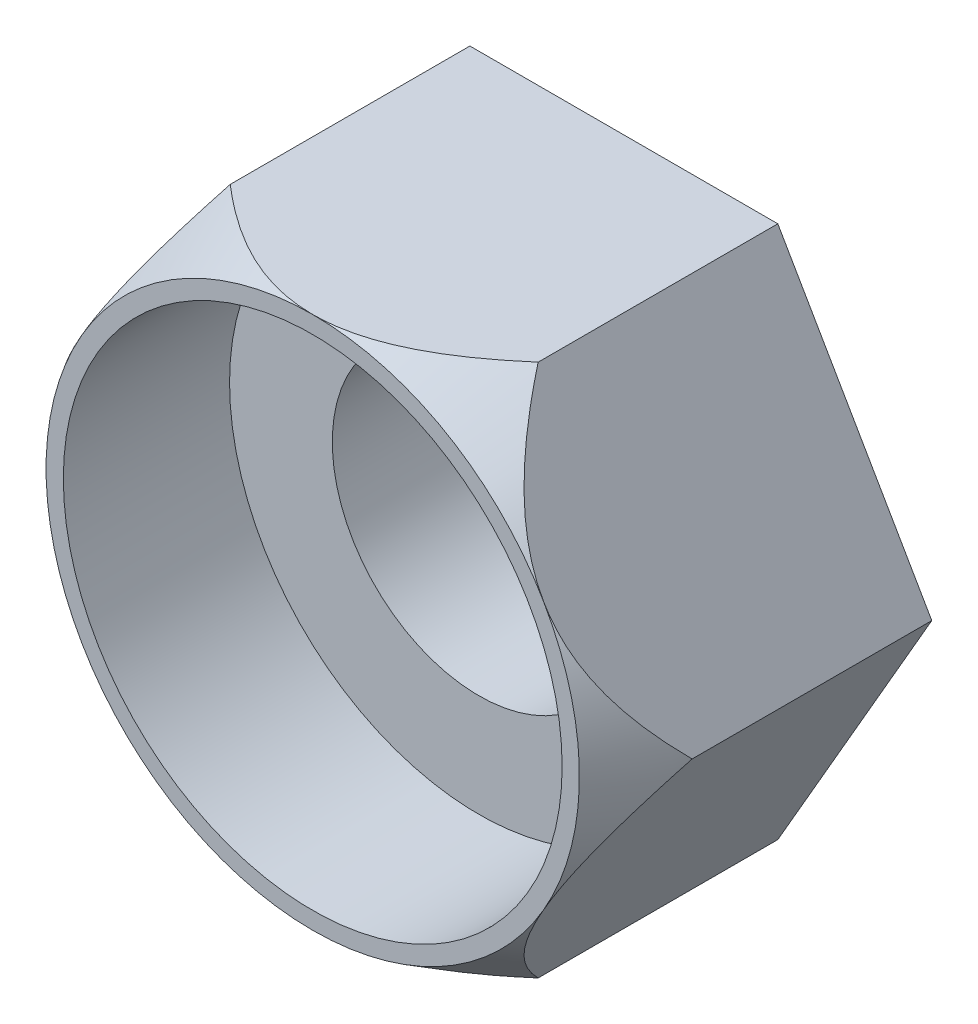
ISO-10303-21;
HEADER;
FILE_DESCRIPTION(('STEP AP214'),'2;1');
FILE_NAME('part.step','',(''),(''),'','','');
FILE_SCHEMA(('AUTOMOTIVE_DESIGN { 1 0 10303 214 1 1 1 1 }'));
ENDSEC;
DATA;
#1=APPLICATION_CONTEXT('core data for automotive mechanical design processes');
#2=APPLICATION_PROTOCOL_DEFINITION('international standard','automotive_design',2000,#1);
#3=PRODUCT_CONTEXT('',#1,'mechanical');
#4=PRODUCT('Part','Part','',(#3));
#5=PRODUCT_RELATED_PRODUCT_CATEGORY('part','',(#4));
#6=PRODUCT_DEFINITION_FORMATION('','',#4);
#7=PRODUCT_DEFINITION_CONTEXT('part definition',#1,'design');
#8=PRODUCT_DEFINITION('design','',#6,#7);
#9=PRODUCT_DEFINITION_SHAPE('','',#8);
#10=(LENGTH_UNIT() NAMED_UNIT(*) SI_UNIT(.MILLI.,.METRE.));
#11=(NAMED_UNIT(*) PLANE_ANGLE_UNIT() SI_UNIT($,.RADIAN.));
#12=(NAMED_UNIT(*) SI_UNIT($,.STERADIAN.) SOLID_ANGLE_UNIT());
#13=UNCERTAINTY_MEASURE_WITH_UNIT(LENGTH_MEASURE(1.E-05),#10,'distance_accuracy_value','');
#14=(GEOMETRIC_REPRESENTATION_CONTEXT(3) GLOBAL_UNCERTAINTY_ASSIGNED_CONTEXT((#13)) GLOBAL_UNIT_ASSIGNED_CONTEXT((#10,
#11,#12)) REPRESENTATION_CONTEXT('',''));
#15=CARTESIAN_POINT('',(0.,0.,0.));
#16=DIRECTION('',(0.,0.,1.));
#17=DIRECTION('',(1.,0.,0.));
#18=AXIS2_PLACEMENT_3D('',#15,#16,#17);
#19=CARTESIAN_POINT('',(17.3205080756888,-30.,17.5));
#20=DIRECTION('',(-0.866025403784439,0.5,0.));
#21=DIRECTION('',(-0.5,-0.866025403784439,0.));
#22=AXIS2_PLACEMENT_3D('',#19,#20,#21);
#23=PLANE('',#22);
#24=CARTESIAN_POINT('',(17.3203926056349,-30.0002,9.46132422606635));
#25=CARTESIAN_POINT('',(17.5015433719719,-29.6864376688743,9.77504736351007));
#26=CARTESIAN_POINT('',(17.6845150908956,-29.3695213553503,10.0846236065358));
#27=CARTESIAN_POINT('',(18.0544721795627,-28.7287368811586,10.6942397910882));
#28=CARTESIAN_POINT('',(18.2414586870006,-28.4048667499463,10.9942769680895));
#29=CARTESIAN_POINT('',(18.620709415875,-27.7479852187283,11.5849420042548));
#30=CARTESIAN_POINT('',(18.8129962456226,-27.4149346599792,11.875511989338));
#31=CARTESIAN_POINT('',(19.2022135833052,-26.7407904559261,12.4438880783537));
#32=CARTESIAN_POINT('',(19.3991437340239,-26.3996974293392,12.7216951593354));
#33=CARTESIAN_POINT('',(19.803174892366,-25.6998949352497,13.2696586125899));
#34=CARTESIAN_POINT('',(20.0104072221741,-25.3409580110513,13.5394302722734));
#35=CARTESIAN_POINT('',(20.4304321667509,-24.6134534665979,14.0610501660691));
#36=CARTESIAN_POINT('',(20.6432254446102,-24.2448846978365,14.3128962492704));
#37=CARTESIAN_POINT('',(21.2895218045095,-23.125466565744,15.0363374820305));
#38=CARTESIAN_POINT('',(21.731973002854,-22.3591186103416,15.4772664210009));
#39=CARTESIAN_POINT('',(22.4331426866156,-21.1446570933396,16.0729561806084));
#40=CARTESIAN_POINT('',(22.683690349479,-20.7106958115425,16.266550291096));
#41=CARTESIAN_POINT('',(23.1913554054523,-19.8313941413695,16.6162103369082));
#42=CARTESIAN_POINT('',(23.4484732889673,-19.386052903587,16.772273461793));
#43=CARTESIAN_POINT('',(23.9661843264303,-18.4893510830619,17.0408901305234));
#44=CARTESIAN_POINT('',(24.2267334071771,-18.0380668373429,17.1537807649683));
#45=CARTESIAN_POINT('',(24.7517830807522,-17.1286541262135,17.3337372313796));
#46=CARTESIAN_POINT('',(25.0162834008726,-16.6705261331467,17.400806211082));
#47=CARTESIAN_POINT('',(25.5496947767419,-15.7466305288059,17.4868130868717));
#48=CARTESIAN_POINT('',(25.8186240451463,-15.2808313722871,17.5053048596655));
#49=CARTESIAN_POINT('',(26.3561672938058,-14.3497791543433,17.4920692193041));
#50=CARTESIAN_POINT('',(26.6247812751322,-13.8845260910625,17.4603419772978));
#51=CARTESIAN_POINT('',(27.1600630395246,-12.9573908787697,17.3478951009107));
#52=CARTESIAN_POINT('',(27.4267245658246,-12.4955195667943,17.2670574843469));
#53=CARTESIAN_POINT('',(27.9555265444054,-11.5796076727494,17.059545195104));
#54=CARTESIAN_POINT('',(28.217666372929,-11.1255681710592,16.9328642505965));
#55=CARTESIAN_POINT('',(28.8109712000303,-10.0979340661439,16.5954865288861));
#56=CARTESIAN_POINT('',(29.1401874153144,-9.52771485459625,16.3710893189568));
#57=CARTESIAN_POINT('',(29.7872125592073,-8.40703443159918,15.8641852466915));
#58=CARTESIAN_POINT('',(30.1050163799999,-7.85658206714694,15.5816527364092));
#59=CARTESIAN_POINT('',(30.7300705233182,-6.7739565334381,14.9675918973374));
#60=CARTESIAN_POINT('',(31.0372719402252,-6.24186807119799,14.6358663929186));
#61=CARTESIAN_POINT('',(31.6401427089066,-5.1976652694438,13.9333706617039));
#62=CARTESIAN_POINT('',(31.9358139486631,-4.68554765984869,13.5626068642423));
#63=CARTESIAN_POINT('',(32.4388584329592,-3.81424905458047,12.892788530556));
#64=CARTESIAN_POINT('',(32.6486994722424,-3.45079371302899,12.6010727982593));
#65=CARTESIAN_POINT('',(33.0630719810684,-2.73307947448248,12.0029851715184));
#66=CARTESIAN_POINT('',(33.267603717481,-2.37882011525572,11.6966140159312));
#67=CARTESIAN_POINT('',(33.6694894287724,-1.68273364446302,11.0747580298597));
#68=CARTESIAN_POINT('',(33.8668982564758,-1.34081152501801,10.7594144353305));
#69=CARTESIAN_POINT('',(34.2572552840001,-0.664693320254428,10.1180198060045));
#70=CARTESIAN_POINT('',(34.4502043938489,-0.330495658721023,9.7919709891245));
#71=CARTESIAN_POINT('',(34.6411316214314,0.00020000000001035,9.46132422606637));
#72=B_SPLINE_CURVE_WITH_KNOTS('',3,(#24,#25,#26,#27,#28,#29,#30,#31,#32,#33,#34,#35,#36,#37,#38,
#39,#40,#41,#42,#43,#44,#45,#46,#47,#48,#49,#50,#51,#52,#53,#54,#55,#56,#57,#58,#59,#60,#61,#62,
#63,#64,#65,#66,#67,#68,#69,#70,#71),.UNSPECIFIED.,.F.,.F.,(4,2,2,2,2,2,2,2,2,2,2,2,2,2,2,2,2,2,
2,2,2,2,2,4),(0.,1.43778765195007,2.87598826086788,4.32176293252995,5.76742673954517,
7.25054658281495,8.73384408840334,11.692930966267,13.3033287566646,14.9138471012569,
16.5115204861772,18.1090841072783,19.7212689536101,21.3334483055512,22.9495161388129,
24.5658051500477,26.6492580458904,28.7336320912353,30.8265986116724,32.919220972703,
34.4522227914168,35.9851474047176,37.5008331274598,39.0162067864697),.UNSPECIFIED.);
#73=CARTESIAN_POINT('',(17.3205080756888,-30.,9.46152422706635));
#74=VERTEX_POINT('',#73);
#75=CARTESIAN_POINT('',(25.9807621135332,-15.,17.5));
#76=VERTEX_POINT('',#75);
#77=EDGE_CURVE('E208',#74,#76,#72,.T.);
#78=ORIENTED_EDGE('',*,*,#77,.F.);
#79=DIRECTION('',(0.,0.,-1.));
#80=VECTOR('',#79,1.);
#81=CARTESIAN_POINT('',(17.3205080756888,-30.,17.5));
#82=LINE('',#81,#80);
#83=CARTESIAN_POINT('',(17.3205080756888,-30.,-17.5));
#84=VERTEX_POINT('',#83);
#85=EDGE_CURVE('E211',#74,#84,#82,.T.);
#86=ORIENTED_EDGE('',*,*,#85,.T.);
#87=DIRECTION('',(0.5,0.866025403784439,0.));
#88=VECTOR('',#87,1.);
#89=CARTESIAN_POINT('',(17.3205080756888,-30.,-17.5));
#90=LINE('',#89,#88);
#91=CARTESIAN_POINT('',(34.6410161513775,0.,-17.5));
#92=VERTEX_POINT('',#91);
#93=EDGE_CURVE('E215',#84,#92,#90,.T.);
#94=ORIENTED_EDGE('',*,*,#93,.T.);
#95=DIRECTION('',(0.,0.,-1.));
#96=VECTOR('',#95,1.);
#97=CARTESIAN_POINT('',(34.6410161513775,0.,17.5));
#98=LINE('',#97,#96);
#99=CARTESIAN_POINT('',(34.6410161513775,0.,9.46152422706636));
#100=VERTEX_POINT('',#99);
#101=EDGE_CURVE('E233',#100,#92,#98,.T.);
#102=ORIENTED_EDGE('',*,*,#101,.F.);
#103=EDGE_CURVE('E214',#76,#100,#72,.T.);
#104=ORIENTED_EDGE('',*,*,#103,.F.);
#105=EDGE_LOOP('',(#78,#86,#94,#102,#104));
#106=FACE_BOUND('',#105,.T.);
#107=ADVANCED_FACE('F37',(#106),#23,.F.);
#108=CARTESIAN_POINT('',(34.6410161513775,0.,17.5));
#109=DIRECTION('',(-0.866025403784439,-0.5,0.));
#110=DIRECTION('',(0.5,-0.866025403784439,0.));
#111=AXIS2_PLACEMENT_3D('',#108,#109,#110);
#112=PLANE('',#111);
#113=CARTESIAN_POINT('',(34.6411316214314,-0.000199999999989065,9.46132422606637));
#114=CARTESIAN_POINT('',(34.4599808550944,0.313562331125672,9.77504736351009));
#115=CARTESIAN_POINT('',(34.2770091361707,0.630478644649733,10.0846236065358));
#116=CARTESIAN_POINT('',(33.9070520475036,1.27126311884139,10.6942397910882));
#117=CARTESIAN_POINT('',(33.7200655400657,1.59513325005368,10.9942769680895));
#118=CARTESIAN_POINT('',(33.3408148111913,2.25201478127171,11.5849420042549));
#119=CARTESIAN_POINT('',(33.1485279814437,2.58506534002085,11.8755119893381));
#120=CARTESIAN_POINT('',(32.7593106437611,3.25920954407389,12.4438880783537));
#121=CARTESIAN_POINT('',(32.5623804930424,3.60030257066084,12.7216951593354));
#122=CARTESIAN_POINT('',(32.1583493347003,4.30010506475032,13.26965861259));
#123=CARTESIAN_POINT('',(31.9511170048922,4.65904198894874,13.5394302722734));
#124=CARTESIAN_POINT('',(31.5310920603154,5.38654653340208,14.0610501660691));
#125=CARTESIAN_POINT('',(31.3182987824561,5.75511530216355,14.3128962492704));
#126=CARTESIAN_POINT('',(30.6720024225568,6.87453343425598,15.0363374820305));
#127=CARTESIAN_POINT('',(30.2295512242123,7.64088138965841,15.4772664210009));
#128=CARTESIAN_POINT('',(29.5283815404507,8.85534290666036,16.0729561806084));
#129=CARTESIAN_POINT('',(29.2778338775873,9.28930418845755,16.266550291096));
#130=CARTESIAN_POINT('',(28.770168821614,10.1686058586305,16.6162103369082));
#131=CARTESIAN_POINT('',(28.513050938099,10.6139470964131,16.772273461793));
#132=CARTESIAN_POINT('',(27.995339900636,11.5106489169381,17.0408901305234));
#133=CARTESIAN_POINT('',(27.7347908198892,11.9619331626571,17.1537807649683));
#134=CARTESIAN_POINT('',(27.2097411463141,12.8713458737865,17.3337372313796));
#135=CARTESIAN_POINT('',(26.9452408261937,13.3294738668534,17.400806211082));
#136=CARTESIAN_POINT('',(26.4118294503244,14.2533694711942,17.4868130868717));
#137=CARTESIAN_POINT('',(26.14290018192,14.7191686277129,17.5053048596655));
#138=CARTESIAN_POINT('',(25.6053569332605,15.6502208456567,17.4920692193041));
#139=CARTESIAN_POINT('',(25.3367429519341,16.1154739089375,17.4603419772977));
#140=CARTESIAN_POINT('',(24.8014611875417,17.0426091212303,17.3478951009107));
#141=CARTESIAN_POINT('',(24.5347996612417,17.5044804332057,17.2670574843469));
#142=CARTESIAN_POINT('',(24.0059976826609,18.4203923272506,17.059545195104));
#143=CARTESIAN_POINT('',(23.7438578541373,18.8744318289408,16.9328642505965));
#144=CARTESIAN_POINT('',(23.150553027036,19.9020659338561,16.5954865288861));
#145=CARTESIAN_POINT('',(22.8213368117519,20.4722851454038,16.3710893189568));
#146=CARTESIAN_POINT('',(22.174311667859,21.5929655684008,15.8641852466915));
#147=CARTESIAN_POINT('',(21.8565078470664,22.1434179328531,15.5816527364092));
#148=CARTESIAN_POINT('',(21.2314537037481,23.2260434665619,14.9675918973374));
#149=CARTESIAN_POINT('',(20.924252286841,23.758131928802,14.6358663929186));
#150=CARTESIAN_POINT('',(20.3213815181597,24.8023347305562,13.9333706617039));
#151=CARTESIAN_POINT('',(20.0257102784032,25.3144523401513,13.5626068642423));
#152=CARTESIAN_POINT('',(19.5226657941071,26.1857509454195,12.8927885305559));
#153=CARTESIAN_POINT('',(19.3128247548239,26.549206286971,12.6010727982593));
#154=CARTESIAN_POINT('',(18.8984522459979,27.2669205255175,12.0029851715184));
#155=CARTESIAN_POINT('',(18.6939205095854,27.6211798847443,11.6966140159312));
#156=CARTESIAN_POINT('',(18.2920347982939,28.317266355537,11.0747580298597));
#157=CARTESIAN_POINT('',(18.0946259705905,28.659188474982,10.7594144353305));
#158=CARTESIAN_POINT('',(17.7042689430662,29.3353066797456,10.1180198060045));
#159=CARTESIAN_POINT('',(17.5113198332173,29.669504341279,9.79197098912449));
#160=CARTESIAN_POINT('',(17.3203926056349,30.0002,9.46132422606636));
#161=B_SPLINE_CURVE_WITH_KNOTS('',3,(#113,#114,#115,#116,#117,#118,#119,#120,#121,#122,#123,
#124,#125,#126,#127,#128,#129,#130,#131,#132,#133,#134,#135,#136,#137,#138,#139,#140,#141,#142,
#143,#144,#145,#146,#147,#148,#149,#150,#151,#152,#153,#154,#155,#156,#157,#158,#159,#160),
.UNSPECIFIED.,.F.,.F.,(4,2,2,2,2,2,2,2,2,2,2,2,2,2,2,2,2,2,2,2,2,2,2,4),(0.,1.43778765195006,
2.87598826086787,4.32176293252995,5.76742673954518,7.25054658281495,8.73384408840334,
11.692930966267,13.3033287566645,14.9138471012568,16.5115204861772,18.1090841072782,
19.7212689536101,21.3334483055512,22.9495161388129,24.5658051500476,26.6492580458904,
28.7336320912353,30.8265986116724,32.919220972703,34.4522227914168,35.9851474047176,
37.5008331274598,39.0162067864697),.UNSPECIFIED.);
#162=CARTESIAN_POINT('',(25.9807621135332,15.,17.5));
#163=VERTEX_POINT('',#162);
#164=EDGE_CURVE('E263',#100,#163,#161,.T.);
#165=ORIENTED_EDGE('',*,*,#164,.F.);
#166=ORIENTED_EDGE('',*,*,#101,.T.);
#167=DIRECTION('',(-0.5,0.866025403784438,0.));
#168=VECTOR('',#167,1.);
#169=CARTESIAN_POINT('',(34.6410161513775,0.,-17.5));
#170=LINE('',#169,#168);
#171=CARTESIAN_POINT('',(17.3205080756888,30.,-17.5));
#172=VERTEX_POINT('',#171);
#173=EDGE_CURVE('E253',#92,#172,#170,.T.);
#174=ORIENTED_EDGE('',*,*,#173,.T.);
#175=DIRECTION('',(0.,0.,-1.));
#176=VECTOR('',#175,1.);
#177=CARTESIAN_POINT('',(17.3205080756888,30.,17.5));
#178=LINE('',#177,#176);
#179=CARTESIAN_POINT('',(17.3205080756889,30.,9.46152422706628));
#180=VERTEX_POINT('',#179);
#181=EDGE_CURVE('E232',#180,#172,#178,.T.);
#182=ORIENTED_EDGE('',*,*,#181,.F.);
#183=EDGE_CURVE('E113',#163,#180,#161,.T.);
#184=ORIENTED_EDGE('',*,*,#183,.F.);
#185=EDGE_LOOP('',(#165,#166,#174,#182,#184));
#186=FACE_BOUND('',#185,.T.);
#187=ADVANCED_FACE('F199',(#186),#112,.F.);
#188=CARTESIAN_POINT('',(17.3205080756888,30.,17.5));
#189=DIRECTION('',(0.,-1.,0.));
#190=DIRECTION('',(0.,0.,-1.));
#191=AXIS2_PLACEMENT_3D('',#188,#189,#190);
#192=PLANE('',#191);
#193=CARTESIAN_POINT('',(54.8417749549226,30.,-38.81063674065));
#194=CARTESIAN_POINT('',(54.3698066975204,30.,-38.0934598874419));
#195=CARTESIAN_POINT('',(53.8968634479029,30.,-37.3769249196472));
#196=CARTESIAN_POINT('',(52.9488718780864,30.,-35.9452467656896));
#197=CARTESIAN_POINT('',(52.4738235533704,30.,-35.2301035825177));
#198=CARTESIAN_POINT('',(51.0452634009373,30.,-33.0868863632887));
#199=CARTESIAN_POINT('',(50.0883641103612,30.,-31.6610668127441));
#200=CARTESIAN_POINT('',(48.1630483284752,30.,-28.8150325186434));
#201=CARTESIAN_POINT('',(47.1946207756503,30.,-27.3948252533106));
#202=CARTESIAN_POINT('',(45.2454130199202,30.,-24.562925599961));
#203=CARTESIAN_POINT('',(44.2646329508382,30.,-23.1512331199424));
#204=CARTESIAN_POINT('',(42.2654967927086,30.,-20.3055131736067));
#205=CARTESIAN_POINT('',(41.2467967780936,30.,-18.8717270547378));
#206=CARTESIAN_POINT('',(39.1908994622977,30.,-16.0173901450402));
#207=CARTESIAN_POINT('',(38.1537017399908,30.,-14.5968396566628));
#208=CARTESIAN_POINT('',(36.5812291042553,30.,-12.4789094563309));
#209=CARTESIAN_POINT('',(36.0544156444764,30.,-11.7752427887318));
#210=CARTESIAN_POINT('',(34.9945112368173,30.,-10.3726559603895));
#211=CARTESIAN_POINT('',(34.4614203326411,30.,-9.67373576665442));
#212=CARTESIAN_POINT('',(33.3882612389497,30.,-8.28131452805852));
#213=CARTESIAN_POINT('',(32.8481933372735,30.,-7.58781326151991));
#214=CARTESIAN_POINT('',(31.7602230811637,30.,-6.20699060126229));
#215=CARTESIAN_POINT('',(31.2123208187983,30.,-5.51966913507362));
#216=CARTESIAN_POINT('',(30.110441563519,30.,-4.15554467570753));
#217=CARTESIAN_POINT('',(29.5565083358308,30.,-3.4787063703457));
#218=CARTESIAN_POINT('',(28.4387720432569,30.,-2.13321547247852));
#219=CARTESIAN_POINT('',(27.8749689586498,30.,-1.46456289633407));
#220=CARTESIAN_POINT('',(26.7359108275702,30.,-0.136566543850093));
#221=CARTESIAN_POINT('',(26.16065093462,30.,0.522773082289273));
#222=CARTESIAN_POINT('',(24.9973372611181,30.,1.83007632139165));
#223=CARTESIAN_POINT('',(24.4092836366771,30.,2.47804007299038));
#224=CARTESIAN_POINT('',(23.2217882522528,30.,3.75681369257884));
#225=CARTESIAN_POINT('',(22.6224275651677,30.,4.38769866943553));
#226=CARTESIAN_POINT('',(21.4069383846953,30.,5.63323499296381));
#227=CARTESIAN_POINT('',(20.7908088173537,30.,6.24788529490313));
#228=CARTESIAN_POINT('',(19.539651514219,30.,7.45680152024008));
#229=CARTESIAN_POINT('',(18.9046375705136,30.,8.05108166964219));
#230=CARTESIAN_POINT('',(17.6123285190527,30.,9.2147991490815));
#231=CARTESIAN_POINT('',(16.9550377765249,30.,9.78424129677916));
#232=CARTESIAN_POINT('',(15.7542362385713,30.,10.7764641279948));
#233=CARTESIAN_POINT('',(15.2155574177048,30.,11.2050794484426));
#234=CARTESIAN_POINT('',(14.1200222863239,30.,12.03854685363));
#235=CARTESIAN_POINT('',(13.5631659401957,30.,12.4433988918077));
#236=CARTESIAN_POINT('',(12.428232906915,30.,13.224811084617));
#237=CARTESIAN_POINT('',(11.8501171544807,30.,13.601314839313));
#238=CARTESIAN_POINT('',(10.6718595544517,30.,14.3184980562226));
#239=CARTESIAN_POINT('',(10.0717165600717,30.,14.6591756496704));
#240=CARTESIAN_POINT('',(8.83721186823437,30.,15.3022172245935));
#241=CARTESIAN_POINT('',(8.20242758286657,30.,15.6037767594259));
#242=CARTESIAN_POINT('',(6.90875843241133,30.,16.1509749452444));
#243=CARTESIAN_POINT('',(6.24987424295473,30.,16.396615162513));
#244=CARTESIAN_POINT('',(5.24710417264603,30.,16.7142636714117));
#245=CARTESIAN_POINT('',(4.91111259043356,30.,16.8115366639721));
#246=CARTESIAN_POINT('',(4.23446498466812,30.,16.9881330038484));
#247=CARTESIAN_POINT('',(3.89380979599959,30.,17.0674595205299));
#248=CARTESIAN_POINT('',(3.20866713569363,30.,17.2069600108132));
#249=CARTESIAN_POINT('',(2.8641805015,30.,17.2671380877624));
#250=CARTESIAN_POINT('',(2.17229107037283,30.,17.3673772590857));
#251=CARTESIAN_POINT('',(1.82488844048348,30.,17.4074394979159));
#252=CARTESIAN_POINT('',(1.17532464512365,30.,17.4627509801405));
#253=CARTESIAN_POINT('',(0.873384408333856,30.,17.4806190110972));
#254=CARTESIAN_POINT('',(0.268947334594082,30.,17.5005477714375));
#255=CARTESIAN_POINT('',(-0.0335495556338399,30.,17.5026068995891));
#256=CARTESIAN_POINT('',(-0.638177225595532,30.,17.4908805501877));
#257=CARTESIAN_POINT('',(-0.940308068673057,30.,17.4770983867141));
#258=CARTESIAN_POINT('',(-1.54346304106426,30.,17.4338961665565));
#259=CARTESIAN_POINT('',(-1.84448700632353,30.,17.404473878967));
#260=CARTESIAN_POINT('',(-2.74550914367045,30.,17.2931635718795));
#261=CARTESIAN_POINT('',(-3.3428024844659,30.,17.1882460028853));
#262=CARTESIAN_POINT('',(-4.52454040322292,30.,16.9221827369976));
#263=CARTESIAN_POINT('',(-5.10898229378963,30.,16.7610253963356));
#264=CARTESIAN_POINT('',(-6.38489609850357,30.,16.3495285934435));
#265=CARTESIAN_POINT('',(-7.07258461940976,30.,16.0874955021665));
#266=CARTESIAN_POINT('',(-8.42172926812182,30.,15.5032591775682));
#267=CARTESIAN_POINT('',(-9.08317618178923,30.,15.1810350323155));
#268=CARTESIAN_POINT('',(-10.3817994160758,30.,14.4870098129129));
#269=CARTESIAN_POINT('',(-11.018899462744,30.,14.1150671216405));
#270=CARTESIAN_POINT('',(-11.9558500877234,30.,13.5278745145276));
#271=CARTESIAN_POINT('',(-12.2650379053911,30.,13.3272728447648));
#272=CARTESIAN_POINT('',(-12.8775360019254,30.,12.917263602686));
#273=CARTESIAN_POINT('',(-13.1808461844221,30.,12.707855886164));
#274=CARTESIAN_POINT('',(-13.9294139733907,30.,12.1764091267126));
#275=CARTESIAN_POINT('',(-14.3712498693582,30.,11.8495496835743));
#276=CARTESIAN_POINT('',(-15.2434983626696,30.,11.1808763196849));
#277=CARTESIAN_POINT('',(-15.6739094750306,30.,10.8390604700583));
#278=CARTESIAN_POINT('',(-16.5244529608709,30.,10.1424616645935));
#279=CARTESIAN_POINT('',(-16.944579941808,30.,9.78767213919694));
#280=CARTESIAN_POINT('',(-17.7752301870979,30.,9.06708055725937));
#281=CARTESIAN_POINT('',(-18.1857538170416,30.,8.70127892115586));
#282=CARTESIAN_POINT('',(-18.9989407597312,30.,7.95932832370775));
#283=CARTESIAN_POINT('',(-19.4015853428894,30.,7.58315886831804));
#284=CARTESIAN_POINT('',(-20.198894457315,30.,6.82244501984019));
#285=CARTESIAN_POINT('',(-20.5935586808821,30.,6.43790030500826));
#286=CARTESIAN_POINT('',(-21.7664415871399,30.,5.27351836008054));
#287=CARTESIAN_POINT('',(-22.5337893336163,30.,4.48271332949142));
#288=CARTESIAN_POINT('',(-24.0511259491533,30.,2.87110265195253));
#289=CARTESIAN_POINT('',(-24.8008926015313,30.,2.05008913436568));
#290=CARTESIAN_POINT('',(-26.279757400597,30.,0.389632814983656));
#291=CARTESIAN_POINT('',(-27.0088546251102,30.,-0.449810806122137));
#292=CARTESIAN_POINT('',(-28.4485887780287,30.,-2.14245469485068));
#293=CARTESIAN_POINT('',(-29.1592485437142,30.,-2.99563559175864));
#294=CARTESIAN_POINT('',(-30.5656826069167,30.,-4.71419836035279));
#295=CARTESIAN_POINT('',(-31.2614564875367,30.,-5.57958057262831));
#296=CARTESIAN_POINT('',(-32.4720660429807,30.,-7.10820720508888));
#297=CARTESIAN_POINT('',(-32.9896484009732,30.,-7.7692814977187));
#298=CARTESIAN_POINT('',(-34.018234822074,30.,-9.09653114579356));
#299=CARTESIAN_POINT('',(-34.5292388446416,30.,-9.7627065326351));
#300=CARTESIAN_POINT('',(-36.0534178371619,30.,-11.7679893416037));
#301=CARTESIAN_POINT('',(-37.0577409971185,30.,-13.1138296468467));
#302=CARTESIAN_POINT('',(-39.0476687517953,30.,-15.8205023769651));
#303=CARTESIAN_POINT('',(-40.0332615172277,30.,-17.1813434711768));
#304=CARTESIAN_POINT('',(-41.9883705902431,30.,-19.9144832009411));
#305=CARTESIAN_POINT('',(-42.9578871250184,30.,-21.2867816741631));
#306=CARTESIAN_POINT('',(-44.8520003896086,30.,-23.9958376963338));
#307=CARTESIAN_POINT('',(-45.7770302526825,30.,-25.3322928379386));
#308=CARTESIAN_POINT('',(-47.6163303112394,30.,-28.0125951720974));
#309=CARTESIAN_POINT('',(-48.5306004287462,30.,-29.3564424181187));
#310=CARTESIAN_POINT('',(-50.3489507636267,30.,-32.0489817257916));
#311=CARTESIAN_POINT('',(-51.2530405511647,30.,-33.3976673307322));
#312=CARTESIAN_POINT('',(-53.0531548256671,30.,-36.1003656375763));
#313=CARTESIAN_POINT('',(-53.9491795043259,30.,-37.4543782117613));
#314=CARTESIAN_POINT('',(-54.8417749549226,30.,-38.81063674065));
#315=B_SPLINE_CURVE_WITH_KNOTS('',3,(#193,#194,#195,#196,#197,#198,#199,#200,#201,#202,#203,
#204,#205,#206,#207,#208,#209,#210,#211,#212,#213,#214,#215,#216,#217,#218,#219,#220,#221,#222,
#223,#224,#225,#226,#227,#228,#229,#230,#231,#232,#233,#234,#235,#236,#237,#238,#239,#240,#241,
#242,#243,#244,#245,#246,#247,#248,#249,#250,#251,#252,#253,#254,#255,#256,#257,#258,#259,#260,
#261,#262,#263,#264,#265,#266,#267,#268,#269,#270,#271,#272,#273,#274,#275,#276,#277,#278,#279,
#280,#281,#282,#283,#284,#285,#286,#287,#288,#289,#290,#291,#292,#293,#294,#295,#296,#297,#298,
#299,#300,#301,#302,#303,#304,#305,#306,#307,#308,#309,#310,#311,#312,#313,#314),.UNSPECIFIED.,
.F.,.F.,(4,2,2,2,2,2,2,2,2,2,2,2,2,2,2,2,2,2,2,2,2,2,2,2,2,2,2,2,2,2,2,2,2,2,2,2,2,2,2,2,2,2,2,
2,2,2,2,2,2,2,2,2,2,2,2,2,2,2,2,2,4),(0.,2.57562850950916,5.15126254827866,10.3026819734722,
15.4595230900626,20.6163083870271,25.8926940341474,31.1691999592875,33.8062367705834,
36.4432552335446,39.0801652504257,41.7170443041883,44.3408088843709,46.964578707843,
49.5894830645975,52.2143554098811,54.824695592763,57.4352033487549,60.0438492223416,
62.6519868436924,64.7166340084099,66.7812852184812,68.8499411591556,70.9187049516782,
73.0248872602211,75.1310105680027,76.1799693987868,77.2287428375298,78.2772913814698,
79.3257802632755,80.232785501438,81.1398826059778,82.0467899756897,82.9538267412942,
84.7698565788008,86.5862626267297,88.7903965046647,90.9952975848896,93.2066184811697,
94.3121868773941,95.4177733852422,97.0661714767035,98.7147827865327,100.364240799425,
102.013635916418,103.666565621858,105.319558938607,108.624572104773,111.959735426287,
115.295047313971,118.626008983534,121.95706381887,124.475790051357,126.994531798722,
132.032106065128,137.072762660946,142.113347960488,146.989365843799,151.86541904207,
156.73642375829,161.607312391307),.UNSPECIFIED.);
#316=CARTESIAN_POINT('',(0.,30.,17.5));
#317=VERTEX_POINT('',#316);
#318=EDGE_CURVE('E109',#180,#317,#315,.T.);
#319=ORIENTED_EDGE('',*,*,#318,.F.);
#320=ORIENTED_EDGE('',*,*,#181,.T.);
#321=DIRECTION('',(-1.,0.,0.));
#322=VECTOR('',#321,1.);
#323=CARTESIAN_POINT('',(17.3205080756888,30.,-17.5));
#324=LINE('',#323,#322);
#325=CARTESIAN_POINT('',(-17.3205080756888,30.,-17.5));
#326=VERTEX_POINT('',#325);
#327=EDGE_CURVE('E255',#172,#326,#324,.T.);
#328=ORIENTED_EDGE('',*,*,#327,.T.);
#329=DIRECTION('',(0.,0.,-1.));
#330=VECTOR('',#329,1.);
#331=CARTESIAN_POINT('',(-17.3205080756888,30.,17.5));
#332=LINE('',#331,#330);
#333=CARTESIAN_POINT('',(-17.3205080756888,30.,9.46152422706634));
#334=VERTEX_POINT('',#333);
#335=EDGE_CURVE('E134',#334,#326,#332,.T.);
#336=ORIENTED_EDGE('',*,*,#335,.F.);
#337=EDGE_CURVE('E117',#317,#334,#315,.T.);
#338=ORIENTED_EDGE('',*,*,#337,.F.);
#339=EDGE_LOOP('',(#319,#320,#328,#336,#338));
#340=FACE_BOUND('',#339,.T.);
#341=ADVANCED_FACE('F132',(#340),#192,.F.);
#342=CARTESIAN_POINT('',(-17.3205080756888,30.,17.5));
#343=DIRECTION('',(0.866025403784439,-0.5,0.));
#344=DIRECTION('',(0.5,0.866025403784439,0.));
#345=AXIS2_PLACEMENT_3D('',#342,#343,#344);
#346=PLANE('',#345);
#347=CARTESIAN_POINT('',(-17.3203926056349,30.0002,9.46132422606635));
#348=CARTESIAN_POINT('',(-17.5015433719719,29.6864376688743,9.77504736351006));
#349=CARTESIAN_POINT('',(-17.6845150908956,29.3695213553503,10.0846236065358));
#350=CARTESIAN_POINT('',(-18.0544721795627,28.7287368811586,10.6942397910882));
#351=CARTESIAN_POINT('',(-18.2414586870006,28.4048667499463,10.9942769680895));
#352=CARTESIAN_POINT('',(-18.620709415875,27.7479852187283,11.5849420042548));
#353=CARTESIAN_POINT('',(-18.8129962456226,27.4149346599792,11.875511989338));
#354=CARTESIAN_POINT('',(-19.2022135833052,26.7407904559261,12.4438880783537));
#355=CARTESIAN_POINT('',(-19.3991437340239,26.3996974293392,12.7216951593354));
#356=CARTESIAN_POINT('',(-19.803174892366,25.6998949352497,13.2696586125899));
#357=CARTESIAN_POINT('',(-20.0104072221741,25.3409580110513,13.5394302722734));
#358=CARTESIAN_POINT('',(-20.4304321667509,24.6134534665979,14.0610501660691));
#359=CARTESIAN_POINT('',(-20.6432254446102,24.2448846978365,14.3128962492704));
#360=CARTESIAN_POINT('',(-21.2895218045095,23.125466565744,15.0363374820305));
#361=CARTESIAN_POINT('',(-21.7319730028541,22.3591186103416,15.4772664210009));
#362=CARTESIAN_POINT('',(-22.4331426866156,21.1446570933396,16.0729561806084));
#363=CARTESIAN_POINT('',(-22.6836903494791,20.7106958115425,16.266550291096));
#364=CARTESIAN_POINT('',(-23.1913554054523,19.8313941413695,16.6162103369082));
#365=CARTESIAN_POINT('',(-23.4484732889673,19.3860529035869,16.772273461793));
#366=CARTESIAN_POINT('',(-23.9661843264303,18.4893510830619,17.0408901305234));
#367=CARTESIAN_POINT('',(-24.2267334071772,18.0380668373429,17.1537807649683));
#368=CARTESIAN_POINT('',(-24.7517830807522,17.1286541262135,17.3337372313796));
#369=CARTESIAN_POINT('',(-25.0162834008726,16.6705261331466,17.400806211082));
#370=CARTESIAN_POINT('',(-25.5496947767419,15.7466305288058,17.4868130868717));
#371=CARTESIAN_POINT('',(-25.8186240451463,15.2808313722871,17.5053048596655));
#372=CARTESIAN_POINT('',(-26.3561672938058,14.3497791543433,17.4920692193041));
#373=CARTESIAN_POINT('',(-26.6247812751322,13.8845260910625,17.4603419772977));
#374=CARTESIAN_POINT('',(-27.1600630395247,12.9573908787697,17.3478951009107));
#375=CARTESIAN_POINT('',(-27.4267245658246,12.4955195667943,17.2670574843469));
#376=CARTESIAN_POINT('',(-27.9555265444054,11.5796076727494,17.059545195104));
#377=CARTESIAN_POINT('',(-28.217666372929,11.1255681710592,16.9328642505965));
#378=CARTESIAN_POINT('',(-28.8109712000303,10.0979340661439,16.5954865288861));
#379=CARTESIAN_POINT('',(-29.1401874153144,9.52771485459624,16.3710893189567));
#380=CARTESIAN_POINT('',(-29.7872125592073,8.40703443159916,15.8641852466915));
#381=CARTESIAN_POINT('',(-30.1050163799999,7.85658206714693,15.5816527364092));
#382=CARTESIAN_POINT('',(-30.7300705233182,6.77395653343809,14.9675918973374));
#383=CARTESIAN_POINT('',(-31.0372719402253,6.24186807119798,14.6358663929186));
#384=CARTESIAN_POINT('',(-31.6401427089066,5.1976652694438,13.9333706617039));
#385=CARTESIAN_POINT('',(-31.9358139486631,4.68554765984869,13.5626068642423));
#386=CARTESIAN_POINT('',(-32.4388584329592,3.81424905458047,12.8927885305559));
#387=CARTESIAN_POINT('',(-32.6486994722424,3.45079371302899,12.6010727982593));
#388=CARTESIAN_POINT('',(-33.0630719810684,2.73307947448248,12.0029851715184));
#389=CARTESIAN_POINT('',(-33.267603717481,2.37882011525571,11.6966140159312));
#390=CARTESIAN_POINT('',(-33.6694894287724,1.68273364446302,11.0747580298597));
#391=CARTESIAN_POINT('',(-33.8668982564758,1.34081152501801,10.7594144353305));
#392=CARTESIAN_POINT('',(-34.2572552840001,0.664693320254432,10.1180198060045));
#393=CARTESIAN_POINT('',(-34.4502043938489,0.330495658721028,9.79197098912449));
#394=CARTESIAN_POINT('',(-34.6411316214314,-0.000200000000003359,9.46132422606636));
#395=B_SPLINE_CURVE_WITH_KNOTS('',3,(#347,#348,#349,#350,#351,#352,#353,#354,#355,#356,#357,
#358,#359,#360,#361,#362,#363,#364,#365,#366,#367,#368,#369,#370,#371,#372,#373,#374,#375,#376,
#377,#378,#379,#380,#381,#382,#383,#384,#385,#386,#387,#388,#389,#390,#391,#392,#393,#394),
.UNSPECIFIED.,.F.,.F.,(4,2,2,2,2,2,2,2,2,2,2,2,2,2,2,2,2,2,2,2,2,2,2,4),(0.,1.43778765195006,
2.87598826086788,4.32176293252995,5.76742673954517,7.25054658281495,8.73384408840334,
11.692930966267,13.3033287566646,14.9138471012569,16.5115204861772,18.1090841072783,
19.7212689536101,21.3334483055512,22.9495161388129,24.5658051500477,26.6492580458904,
28.7336320912353,30.8265986116725,32.919220972703,34.4522227914168,35.9851474047176,
37.5008331274598,39.0162067864697),.UNSPECIFIED.);
#396=CARTESIAN_POINT('',(-25.9807621135332,15.,17.5));
#397=VERTEX_POINT('',#396);
#398=EDGE_CURVE('E122',#334,#397,#395,.T.);
#399=ORIENTED_EDGE('',*,*,#398,.F.);
#400=ORIENTED_EDGE('',*,*,#335,.T.);
#401=DIRECTION('',(-0.5,-0.866025403784439,0.));
#402=VECTOR('',#401,1.);
#403=CARTESIAN_POINT('',(-17.3205080756888,30.,-17.5));
#404=LINE('',#403,#402);
#405=CARTESIAN_POINT('',(-34.6410161513775,0.,-17.5));
#406=VERTEX_POINT('',#405);
#407=EDGE_CURVE('E250',#326,#406,#404,.T.);
#408=ORIENTED_EDGE('',*,*,#407,.T.);
#409=DIRECTION('',(0.,0.,-1.));
#410=VECTOR('',#409,1.);
#411=CARTESIAN_POINT('',(-34.6410161513775,0.,17.5));
#412=LINE('',#411,#410);
#413=CARTESIAN_POINT('',(-34.6410161513775,0.,9.46152422706635));
#414=VERTEX_POINT('',#413);
#415=EDGE_CURVE('E224',#414,#406,#412,.T.);
#416=ORIENTED_EDGE('',*,*,#415,.F.);
#417=EDGE_CURVE('E135',#397,#414,#395,.T.);
#418=ORIENTED_EDGE('',*,*,#417,.F.);
#419=EDGE_LOOP('',(#399,#400,#408,#416,#418));
#420=FACE_BOUND('',#419,.T.);
#421=ADVANCED_FACE('F190',(#420),#346,.F.);
#422=CARTESIAN_POINT('',(-34.6410161513775,0.,17.5));
#423=DIRECTION('',(0.866025403784439,0.5,0.));
#424=DIRECTION('',(-0.5,0.866025403784439,0.));
#425=AXIS2_PLACEMENT_3D('',#422,#423,#424);
#426=PLANE('',#425);
#427=CARTESIAN_POINT('',(-34.6411316214314,0.000199999999995692,9.46132422606636));
#428=CARTESIAN_POINT('',(-34.4599808550944,-0.313562331125667,9.77504736351007));
#429=CARTESIAN_POINT('',(-34.2770091361707,-0.630478644649726,10.0846236065358));
#430=CARTESIAN_POINT('',(-33.9070520475036,-1.27126311884138,10.6942397910882));
#431=CARTESIAN_POINT('',(-33.7200655400657,-1.59513325005367,10.9942769680895));
#432=CARTESIAN_POINT('',(-33.3408148111913,-2.25201478127171,11.5849420042548));
#433=CARTESIAN_POINT('',(-33.1485279814437,-2.58506534002085,11.875511989338));
#434=CARTESIAN_POINT('',(-32.7593106437611,-3.25920954407389,12.4438880783537));
#435=CARTESIAN_POINT('',(-32.5623804930424,-3.60030257066084,12.7216951593354));
#436=CARTESIAN_POINT('',(-32.1583493347003,-4.30010506475031,13.26965861259));
#437=CARTESIAN_POINT('',(-31.9511170048922,-4.65904198894873,13.5394302722734));
#438=CARTESIAN_POINT('',(-31.5310920603154,-5.38654653340207,14.0610501660691));
#439=CARTESIAN_POINT('',(-31.3182987824561,-5.75511530216355,14.3128962492704));
#440=CARTESIAN_POINT('',(-30.6720024225568,-6.87453343425598,15.0363374820305));
#441=CARTESIAN_POINT('',(-30.2295512242123,-7.64088138965841,15.4772664210009));
#442=CARTESIAN_POINT('',(-29.5283815404507,-8.85534290666036,16.0729561806084));
#443=CARTESIAN_POINT('',(-29.2778338775873,-9.28930418845755,16.266550291096));
#444=CARTESIAN_POINT('',(-28.770168821614,-10.1686058586305,16.6162103369082));
#445=CARTESIAN_POINT('',(-28.513050938099,-10.6139470964131,16.772273461793));
#446=CARTESIAN_POINT('',(-27.9953399006361,-11.5106489169381,17.0408901305234));
#447=CARTESIAN_POINT('',(-27.7347908198892,-11.9619331626571,17.1537807649683));
#448=CARTESIAN_POINT('',(-27.2097411463141,-12.8713458737865,17.3337372313796));
#449=CARTESIAN_POINT('',(-26.9452408261937,-13.3294738668534,17.400806211082));
#450=CARTESIAN_POINT('',(-26.4118294503244,-14.2533694711942,17.4868130868717));
#451=CARTESIAN_POINT('',(-26.14290018192,-14.7191686277129,17.5053048596655));
#452=CARTESIAN_POINT('',(-25.6053569332605,-15.6502208456567,17.4920692193041));
#453=CARTESIAN_POINT('',(-25.3367429519341,-16.1154739089375,17.4603419772977));
#454=CARTESIAN_POINT('',(-24.8014611875417,-17.0426091212303,17.3478951009107));
#455=CARTESIAN_POINT('',(-24.5347996612417,-17.5044804332057,17.2670574843469));
#456=CARTESIAN_POINT('',(-24.0059976826609,-18.4203923272507,17.059545195104));
#457=CARTESIAN_POINT('',(-23.7438578541373,-18.8744318289409,16.9328642505965));
#458=CARTESIAN_POINT('',(-23.150553027036,-19.9020659338562,16.5954865288861));
#459=CARTESIAN_POINT('',(-22.8213368117519,-20.4722851454038,16.3710893189567));
#460=CARTESIAN_POINT('',(-22.174311667859,-21.5929655684008,15.8641852466915));
#461=CARTESIAN_POINT('',(-21.8565078470664,-22.1434179328531,15.5816527364092));
#462=CARTESIAN_POINT('',(-21.2314537037481,-23.2260434665619,14.9675918973373));
#463=CARTESIAN_POINT('',(-20.9242522868411,-23.758131928802,14.6358663929186));
#464=CARTESIAN_POINT('',(-20.3213815181597,-24.8023347305562,13.9333706617038));
#465=CARTESIAN_POINT('',(-20.0257102784032,-25.3144523401513,13.5626068642423));
#466=CARTESIAN_POINT('',(-19.5226657941071,-26.1857509454195,12.8927885305559));
#467=CARTESIAN_POINT('',(-19.3128247548239,-26.549206286971,12.6010727982593));
#468=CARTESIAN_POINT('',(-18.8984522459979,-27.2669205255175,12.0029851715184));
#469=CARTESIAN_POINT('',(-18.6939205095854,-27.6211798847443,11.6966140159312));
#470=CARTESIAN_POINT('',(-18.2920347982939,-28.317266355537,11.0747580298597));
#471=CARTESIAN_POINT('',(-18.0946259705905,-28.659188474982,10.7594144353305));
#472=CARTESIAN_POINT('',(-17.7042689430662,-29.3353066797456,10.1180198060045));
#473=CARTESIAN_POINT('',(-17.5113198332174,-29.669504341279,9.79197098912448));
#474=CARTESIAN_POINT('',(-17.3203926056349,-30.0002,9.46132422606635));
#475=B_SPLINE_CURVE_WITH_KNOTS('',3,(#427,#428,#429,#430,#431,#432,#433,#434,#435,#436,#437,
#438,#439,#440,#441,#442,#443,#444,#445,#446,#447,#448,#449,#450,#451,#452,#453,#454,#455,#456,
#457,#458,#459,#460,#461,#462,#463,#464,#465,#466,#467,#468,#469,#470,#471,#472,#473,#474),
.UNSPECIFIED.,.F.,.F.,(4,2,2,2,2,2,2,2,2,2,2,2,2,2,2,2,2,2,2,2,2,2,2,4),(0.,1.43778765195006,
2.87598826086787,4.32176293252995,5.76742673954518,7.25054658281495,8.73384408840334,
11.692930966267,13.3033287566646,14.9138471012569,16.5115204861772,18.1090841072783,
19.7212689536101,21.3334483055512,22.9495161388129,24.5658051500477,26.6492580458904,
28.7336320912353,30.8265986116725,32.919220972703,34.4522227914168,35.9851474047176,
37.5008331274598,39.0162067864697),.UNSPECIFIED.);
#476=CARTESIAN_POINT('',(-25.9807621135332,-15.,17.5));
#477=VERTEX_POINT('',#476);
#478=EDGE_CURVE('E184',#414,#477,#475,.T.);
#479=ORIENTED_EDGE('',*,*,#478,.F.);
#480=ORIENTED_EDGE('',*,*,#415,.T.);
#481=DIRECTION('',(0.5,-0.866025403784439,0.));
#482=VECTOR('',#481,1.);
#483=CARTESIAN_POINT('',(-34.6410161513775,0.,-17.5));
#484=LINE('',#483,#482);
#485=CARTESIAN_POINT('',(-17.3205080756888,-30.,-17.5));
#486=VERTEX_POINT('',#485);
#487=EDGE_CURVE('E226',#406,#486,#484,.T.);
#488=ORIENTED_EDGE('',*,*,#487,.T.);
#489=DIRECTION('',(0.,0.,-1.));
#490=VECTOR('',#489,1.);
#491=CARTESIAN_POINT('',(-17.3205080756888,-30.,17.5));
#492=LINE('',#491,#490);
#493=CARTESIAN_POINT('',(-17.3205080756889,-30.,9.46152422706627));
#494=VERTEX_POINT('',#493);
#495=EDGE_CURVE('E222',#494,#486,#492,.T.);
#496=ORIENTED_EDGE('',*,*,#495,.F.);
#497=EDGE_CURVE('E177',#477,#494,#475,.T.);
#498=ORIENTED_EDGE('',*,*,#497,.F.);
#499=EDGE_LOOP('',(#479,#480,#488,#496,#498));
#500=FACE_BOUND('',#499,.T.);
#501=ADVANCED_FACE('F186',(#500),#426,.F.);
#502=CARTESIAN_POINT('',(-17.3205080756888,-30.,17.5));
#503=DIRECTION('',(0.,1.,0.));
#504=DIRECTION('',(-1.,0.,0.));
#505=AXIS2_PLACEMENT_3D('',#502,#503,#504);
#506=PLANE('',#505);
#507=CARTESIAN_POINT('',(-54.8417749549226,-30.,-38.8106367406501));
#508=CARTESIAN_POINT('',(-54.3698066975204,-30.,-38.0934598874419));
#509=CARTESIAN_POINT('',(-53.8968634479029,-30.,-37.3769249196473));
#510=CARTESIAN_POINT('',(-52.9488718780864,-30.,-35.9452467656896));
#511=CARTESIAN_POINT('',(-52.4738235533704,-30.,-35.2301035825177));
#512=CARTESIAN_POINT('',(-51.0452634009373,-30.,-33.0868863632887));
#513=CARTESIAN_POINT('',(-50.0883641103612,-30.,-31.6610668127441));
#514=CARTESIAN_POINT('',(-48.1630483284752,-30.,-28.8150325186434));
#515=CARTESIAN_POINT('',(-47.1946207756503,-30.,-27.3948252533106));
#516=CARTESIAN_POINT('',(-45.2454130199202,-30.,-24.5629255999611));
#517=CARTESIAN_POINT('',(-44.2646329508382,-30.,-23.1512331199424));
#518=CARTESIAN_POINT('',(-42.2654967927086,-30.,-20.3055131736067));
#519=CARTESIAN_POINT('',(-41.2467967780936,-30.,-18.8717270547379));
#520=CARTESIAN_POINT('',(-39.1908994622978,-30.,-16.0173901450402));
#521=CARTESIAN_POINT('',(-38.1537017399908,-30.,-14.5968396566628));
#522=CARTESIAN_POINT('',(-36.5812291042554,-30.,-12.478909456331));
#523=CARTESIAN_POINT('',(-36.0544156444764,-30.,-11.7752427887319));
#524=CARTESIAN_POINT('',(-34.9945112368173,-30.,-10.3726559603895));
#525=CARTESIAN_POINT('',(-34.4614203326411,-30.,-9.67373576665444));
#526=CARTESIAN_POINT('',(-33.3882612389497,-30.,-8.28131452805854));
#527=CARTESIAN_POINT('',(-32.8481933372735,-30.,-7.58781326151992));
#528=CARTESIAN_POINT('',(-31.7602230811637,-30.,-6.2069906012623));
#529=CARTESIAN_POINT('',(-31.2123208187983,-30.,-5.51966913507364));
#530=CARTESIAN_POINT('',(-30.1104415635191,-30.,-4.15554467570754));
#531=CARTESIAN_POINT('',(-29.5565083358308,-30.,-3.47870637034571));
#532=CARTESIAN_POINT('',(-28.438772043257,-30.,-2.13321547247853));
#533=CARTESIAN_POINT('',(-27.8749689586498,-30.,-1.46456289633409));
#534=CARTESIAN_POINT('',(-26.7359108275702,-30.,-0.136566543850116));
#535=CARTESIAN_POINT('',(-26.16065093462,-30.,0.522773082289249));
#536=CARTESIAN_POINT('',(-24.9973372611181,-30.,1.83007632139162));
#537=CARTESIAN_POINT('',(-24.4092836366772,-30.,2.47804007299036));
#538=CARTESIAN_POINT('',(-23.2217882522528,-30.,3.75681369257882));
#539=CARTESIAN_POINT('',(-22.6224275651677,-30.,4.38769866943551));
#540=CARTESIAN_POINT('',(-21.4069383846953,-30.,5.6332349929638));
#541=CARTESIAN_POINT('',(-20.7908088173538,-30.,6.24788529490313));
#542=CARTESIAN_POINT('',(-19.539651514219,-30.,7.45680152024007));
#543=CARTESIAN_POINT('',(-18.9046375705136,-30.,8.05108166964218));
#544=CARTESIAN_POINT('',(-17.6123285190527,-30.,9.21479914908149));
#545=CARTESIAN_POINT('',(-16.9550377765249,-30.,9.78424129677915));
#546=CARTESIAN_POINT('',(-15.7542362385713,-30.,10.7764641279948));
#547=CARTESIAN_POINT('',(-15.2155574177048,-30.,11.2050794484426));
#548=CARTESIAN_POINT('',(-14.1200222863239,-30.,12.03854685363));
#549=CARTESIAN_POINT('',(-13.5631659401957,-30.,12.4433988918077));
#550=CARTESIAN_POINT('',(-12.4282329069151,-30.,13.224811084617));
#551=CARTESIAN_POINT('',(-11.8501171544807,-30.,13.601314839313));
#552=CARTESIAN_POINT('',(-10.6718595544517,-30.,14.3184980562226));
#553=CARTESIAN_POINT('',(-10.0717165600717,-30.,14.6591756496704));
#554=CARTESIAN_POINT('',(-8.8372118682344,-30.,15.3022172245935));
#555=CARTESIAN_POINT('',(-8.20242758286659,-30.,15.6037767594259));
#556=CARTESIAN_POINT('',(-6.90875843241135,-30.,16.1509749452444));
#557=CARTESIAN_POINT('',(-6.24987424295476,-30.,16.396615162513));
#558=CARTESIAN_POINT('',(-5.24710417264605,-30.,16.7142636714117));
#559=CARTESIAN_POINT('',(-4.91111259043359,-30.,16.8115366639721));
#560=CARTESIAN_POINT('',(-4.23446498466815,-30.,16.9881330038484));
#561=CARTESIAN_POINT('',(-3.89380979599961,-30.,17.0674595205299));
#562=CARTESIAN_POINT('',(-3.20866713569366,-30.,17.2069600108132));
#563=CARTESIAN_POINT('',(-2.86418050150002,-30.,17.2671380877624));
#564=CARTESIAN_POINT('',(-2.17229107037285,-30.,17.3673772590857));
#565=CARTESIAN_POINT('',(-1.8248884404835,-30.,17.4074394979159));
#566=CARTESIAN_POINT('',(-1.17532464512366,-30.,17.4627509801405));
#567=CARTESIAN_POINT('',(-0.873384408333871,-30.,17.4806190110972));
#568=CARTESIAN_POINT('',(-0.268947334594097,-30.,17.5005477714375));
#569=CARTESIAN_POINT('',(0.0335495556338231,-30.,17.5026068995891));
#570=CARTESIAN_POINT('',(0.638177225595513,-30.,17.4908805501877));
#571=CARTESIAN_POINT('',(0.940308068673038,-30.,17.4770983867141));
#572=CARTESIAN_POINT('',(1.54346304106424,-30.,17.4338961665565));
#573=CARTESIAN_POINT('',(1.84448700632352,-30.,17.404473878967));
#574=CARTESIAN_POINT('',(2.74550914367043,-30.,17.2931635718795));
#575=CARTESIAN_POINT('',(3.34280248446589,-30.,17.1882460028853));
#576=CARTESIAN_POINT('',(4.5245404032229,-30.,16.9221827369976));
#577=CARTESIAN_POINT('',(5.10898229378962,-30.,16.7610253963356));
#578=CARTESIAN_POINT('',(6.38489609850355,-30.,16.3495285934436));
#579=CARTESIAN_POINT('',(7.07258461940975,-30.,16.0874955021665));
#580=CARTESIAN_POINT('',(8.42172926812181,-30.,15.5032591775682));
#581=CARTESIAN_POINT('',(9.08317618178922,-30.,15.1810350323155));
#582=CARTESIAN_POINT('',(10.3817994160758,-30.,14.4870098129129));
#583=CARTESIAN_POINT('',(11.018899462744,-30.,14.1150671216405));
#584=CARTESIAN_POINT('',(11.9558500877234,-30.,13.5278745145276));
#585=CARTESIAN_POINT('',(12.2650379053911,-30.,13.3272728447648));
#586=CARTESIAN_POINT('',(12.8775360019254,-30.,12.917263602686));
#587=CARTESIAN_POINT('',(13.1808461844221,-30.,12.7078558861641));
#588=CARTESIAN_POINT('',(13.9294139733907,-30.,12.1764091267126));
#589=CARTESIAN_POINT('',(14.3712498693582,-30.,11.8495496835743));
#590=CARTESIAN_POINT('',(15.2434983626696,-30.,11.1808763196849));
#591=CARTESIAN_POINT('',(15.6739094750306,-30.,10.8390604700583));
#592=CARTESIAN_POINT('',(16.5244529608709,-30.,10.1424616645936));
#593=CARTESIAN_POINT('',(16.944579941808,-30.,9.78767213919695));
#594=CARTESIAN_POINT('',(17.7752301870979,-30.,9.06708055725938));
#595=CARTESIAN_POINT('',(18.1857538170416,-30.,8.70127892115587));
#596=CARTESIAN_POINT('',(18.9989407597312,-30.,7.95932832370776));
#597=CARTESIAN_POINT('',(19.4015853428893,-30.,7.58315886831805));
#598=CARTESIAN_POINT('',(20.198894457315,-30.,6.82244501984021));
#599=CARTESIAN_POINT('',(20.593558680882,-30.,6.43790030500828));
#600=CARTESIAN_POINT('',(21.7664415871399,-30.,5.27351836008056));
#601=CARTESIAN_POINT('',(22.5337893336163,-30.,4.48271332949145));
#602=CARTESIAN_POINT('',(24.0511259491533,-30.,2.87110265195255));
#603=CARTESIAN_POINT('',(24.8008926015313,-30.,2.0500891343657));
#604=CARTESIAN_POINT('',(26.279757400597,-30.,0.389632814983673));
#605=CARTESIAN_POINT('',(27.0088546251102,-30.,-0.449810806122118));
#606=CARTESIAN_POINT('',(28.4485887780286,-30.,-2.14245469485066));
#607=CARTESIAN_POINT('',(29.1592485437142,-30.,-2.99563559175862));
#608=CARTESIAN_POINT('',(30.5656826069167,-30.,-4.71419836035277));
#609=CARTESIAN_POINT('',(31.2614564875366,-30.,-5.57958057262829));
#610=CARTESIAN_POINT('',(32.4720660429807,-30.,-7.10820720508887));
#611=CARTESIAN_POINT('',(32.9896484009732,-30.,-7.7692814977187));
#612=CARTESIAN_POINT('',(34.018234822074,-30.,-9.09653114579356));
#613=CARTESIAN_POINT('',(34.5292388446416,-30.,-9.7627065326351));
#614=CARTESIAN_POINT('',(36.0534178371619,-30.,-11.7679893416037));
#615=CARTESIAN_POINT('',(37.0577409971185,-30.,-13.1138296468467));
#616=CARTESIAN_POINT('',(39.0476687517953,-30.,-15.820502376965));
#617=CARTESIAN_POINT('',(40.0332615172277,-30.,-17.1813434711768));
#618=CARTESIAN_POINT('',(41.9883705902431,-30.,-19.9144832009411));
#619=CARTESIAN_POINT('',(42.9578871250184,-30.,-21.2867816741631));
#620=CARTESIAN_POINT('',(44.8520003896086,-30.,-23.9958376963338));
#621=CARTESIAN_POINT('',(45.7770302526825,-30.,-25.3322928379386));
#622=CARTESIAN_POINT('',(47.6163303112395,-30.,-28.0125951720974));
#623=CARTESIAN_POINT('',(48.5306004287462,-30.,-29.3564424181187));
#624=CARTESIAN_POINT('',(50.3489507636267,-30.,-32.0489817257916));
#625=CARTESIAN_POINT('',(51.2530405511647,-30.,-33.3976673307323));
#626=CARTESIAN_POINT('',(53.0531548256671,-30.,-36.1003656375764));
#627=CARTESIAN_POINT('',(53.9491795043259,-30.,-37.4543782117613));
#628=CARTESIAN_POINT('',(54.8417749549226,-30.,-38.8106367406501));
#629=B_SPLINE_CURVE_WITH_KNOTS('',3,(#507,#508,#509,#510,#511,#512,#513,#514,#515,#516,#517,
#518,#519,#520,#521,#522,#523,#524,#525,#526,#527,#528,#529,#530,#531,#532,#533,#534,#535,#536,
#537,#538,#539,#540,#541,#542,#543,#544,#545,#546,#547,#548,#549,#550,#551,#552,#553,#554,#555,
#556,#557,#558,#559,#560,#561,#562,#563,#564,#565,#566,#567,#568,#569,#570,#571,#572,#573,#574,
#575,#576,#577,#578,#579,#580,#581,#582,#583,#584,#585,#586,#587,#588,#589,#590,#591,#592,#593,
#594,#595,#596,#597,#598,#599,#600,#601,#602,#603,#604,#605,#606,#607,#608,#609,#610,#611,#612,
#613,#614,#615,#616,#617,#618,#619,#620,#621,#622,#623,#624,#625,#626,#627,#628),.UNSPECIFIED.,
.F.,.F.,(4,2,2,2,2,2,2,2,2,2,2,2,2,2,2,2,2,2,2,2,2,2,2,2,2,2,2,2,2,2,2,2,2,2,2,2,2,2,2,2,2,2,2,
2,2,2,2,2,2,2,2,2,2,2,2,2,2,2,2,2,4),(0.,2.57562850950916,5.15126254827866,10.3026819734722,
15.4595230900626,20.6163083870271,25.8926940341474,31.1691999592875,33.8062367705834,
36.4432552335446,39.0801652504257,41.7170443041883,44.3408088843709,46.964578707843,
49.5894830645975,52.2143554098811,54.824695592763,57.4352033487549,60.0438492223416,
62.6519868436924,64.7166340084099,66.7812852184812,68.8499411591556,70.9187049516782,
73.0248872602211,75.1310105680027,76.1799693987868,77.2287428375298,78.2772913814698,
79.3257802632755,80.232785501438,81.1398826059778,82.0467899756897,82.9538267412942,
84.7698565788008,86.5862626267297,88.7903965046647,90.9952975848896,93.2066184811697,
94.3121868773941,95.4177733852422,97.0661714767035,98.7147827865327,100.364240799425,
102.013635916418,103.666565621858,105.319558938607,108.624572104773,111.959735426287,
115.295047313971,118.626008983534,121.95706381887,124.475790051357,126.994531798722,
132.032106065128,137.072762660946,142.113347960488,146.989365843799,151.86541904207,
156.73642375829,161.607312391307),.UNSPECIFIED.);
#630=CARTESIAN_POINT('',(0.,-30.,17.5));
#631=VERTEX_POINT('',#630);
#632=EDGE_CURVE('E185',#494,#631,#629,.T.);
#633=ORIENTED_EDGE('',*,*,#632,.F.);
#634=ORIENTED_EDGE('',*,*,#495,.T.);
#635=DIRECTION('',(1.,0.,0.));
#636=VECTOR('',#635,1.);
#637=CARTESIAN_POINT('',(-17.3205080756888,-30.,-17.5));
#638=LINE('',#637,#636);
#639=EDGE_CURVE('E220',#486,#84,#638,.T.);
#640=ORIENTED_EDGE('',*,*,#639,.T.);
#641=ORIENTED_EDGE('',*,*,#85,.F.);
#642=EDGE_CURVE('E128',#631,#74,#629,.T.);
#643=ORIENTED_EDGE('',*,*,#642,.F.);
#644=EDGE_LOOP('',(#633,#634,#640,#641,#643));
#645=FACE_BOUND('',#644,.T.);
#646=ADVANCED_FACE('F189',(#645),#506,.F.);
#647=CARTESIAN_POINT('',(0.,0.,-17.5));
#648=DIRECTION('',(0.,0.,1.));
#649=DIRECTION('',(1.,0.,0.));
#650=AXIS2_PLACEMENT_3D('',#647,#648,#649);
#651=PLANE('',#650);
#652=CARTESIAN_POINT('',(0.,0.,-17.5));
#653=DIRECTION('',(0.,0.,1.));
#654=DIRECTION('',(1.,0.,0.));
#655=AXIS2_PLACEMENT_3D('',#652,#653,#654);
#656=CIRCLE('',#655,16.5);
#657=CARTESIAN_POINT('',(16.5,0.,-17.5));
#658=VERTEX_POINT('',#657);
#659=EDGE_CURVE('E129',#658,#658,#656,.T.);
#660=ORIENTED_EDGE('',*,*,#659,.T.);
#661=EDGE_LOOP('',(#660));
#662=FACE_BOUND('',#661,.T.);
#663=ORIENTED_EDGE('',*,*,#93,.F.);
#664=ORIENTED_EDGE('',*,*,#639,.F.);
#665=ORIENTED_EDGE('',*,*,#487,.F.);
#666=ORIENTED_EDGE('',*,*,#407,.F.);
#667=ORIENTED_EDGE('',*,*,#327,.F.);
#668=ORIENTED_EDGE('',*,*,#173,.F.);
#669=EDGE_LOOP('',(#663,#664,#665,#666,#667,#668));
#670=FACE_BOUND('',#669,.T.);
#671=ADVANCED_FACE('F251',(#662,#670),#651,.F.);
#672=CARTESIAN_POINT('',(0.,0.,17.5));
#673=DIRECTION('',(0.,0.,-1.));
#674=DIRECTION('',(1.,0.,0.));
#675=AXIS2_PLACEMENT_3D('',#672,#673,#674);
#676=CONICAL_SURFACE('',#675,30.,0.5235987755983);
#677=ORIENTED_EDGE('',*,*,#103,.T.);
#678=ORIENTED_EDGE('',*,*,#164,.T.);
#679=CARTESIAN_POINT('',(0.,0.,17.5));
#680=DIRECTION('',(0.,0.,1.));
#681=DIRECTION('',(1.,0.,0.));
#682=AXIS2_PLACEMENT_3D('',#679,#680,#681);
#683=CIRCLE('',#682,30.);
#684=EDGE_CURVE('E41',#76,#163,#683,.T.);
#685=ORIENTED_EDGE('',*,*,#684,.F.);
#686=EDGE_LOOP('',(#677,#678,#685));
#687=FACE_BOUND('',#686,.T.);
#688=ADVANCED_FACE('F162',(#687),#676,.T.);
#689=ORIENTED_EDGE('',*,*,#77,.T.);
#690=EDGE_CURVE('E237',#631,#76,#683,.T.);
#691=ORIENTED_EDGE('',*,*,#690,.F.);
#692=ORIENTED_EDGE('',*,*,#642,.T.);
#693=EDGE_LOOP('',(#689,#691,#692));
#694=FACE_BOUND('',#693,.T.);
#695=ADVANCED_FACE('F156',(#694),#676,.T.);
#696=ORIENTED_EDGE('',*,*,#497,.T.);
#697=ORIENTED_EDGE('',*,*,#632,.T.);
#698=EDGE_CURVE('E61',#477,#631,#683,.T.);
#699=ORIENTED_EDGE('',*,*,#698,.F.);
#700=EDGE_LOOP('',(#696,#697,#699));
#701=FACE_BOUND('',#700,.T.);
#702=ADVANCED_FACE('F161',(#701),#676,.T.);
#703=ORIENTED_EDGE('',*,*,#417,.T.);
#704=ORIENTED_EDGE('',*,*,#478,.T.);
#705=EDGE_CURVE('E46',#397,#477,#683,.T.);
#706=ORIENTED_EDGE('',*,*,#705,.F.);
#707=EDGE_LOOP('',(#703,#704,#706));
#708=FACE_BOUND('',#707,.T.);
#709=ADVANCED_FACE('F276',(#708),#676,.T.);
#710=ORIENTED_EDGE('',*,*,#337,.T.);
#711=ORIENTED_EDGE('',*,*,#398,.T.);
#712=EDGE_CURVE('E12',#317,#397,#683,.T.);
#713=ORIENTED_EDGE('',*,*,#712,.F.);
#714=EDGE_LOOP('',(#710,#711,#713));
#715=FACE_BOUND('',#714,.T.);
#716=ADVANCED_FACE('F120',(#715),#676,.T.);
#717=ORIENTED_EDGE('',*,*,#183,.T.);
#718=ORIENTED_EDGE('',*,*,#318,.T.);
#719=CARTESIAN_POINT('',(0.,0.,17.5));
#720=DIRECTION('',(0.,0.,1.));
#721=DIRECTION('',(1.,0.,0.));
#722=AXIS2_PLACEMENT_3D('',#719,#720,#721);
#723=CIRCLE('',#722,30.);
#724=EDGE_CURVE('E53',#163,#317,#723,.T.);
#725=ORIENTED_EDGE('',*,*,#724,.F.);
#726=EDGE_LOOP('',(#717,#718,#725));
#727=FACE_BOUND('',#726,.T.);
#728=ADVANCED_FACE('F111',(#727),#676,.T.);
#729=CARTESIAN_POINT('',(0.,0.,17.5));
#730=DIRECTION('',(0.,0.,1.));
#731=DIRECTION('',(1.,0.,0.));
#732=AXIS2_PLACEMENT_3D('',#729,#730,#731);
#733=PLANE('',#732);
#734=CARTESIAN_POINT('',(0.,0.,17.5));
#735=DIRECTION('',(0.,0.,1.));
#736=DIRECTION('',(1.,0.,0.));
#737=AXIS2_PLACEMENT_3D('',#734,#735,#736);
#738=CIRCLE('',#737,28.058);
#739=CARTESIAN_POINT('',(28.058,0.,17.5));
#740=VERTEX_POINT('',#739);
#741=EDGE_CURVE('E377',#740,#740,#738,.T.);
#742=ORIENTED_EDGE('',*,*,#741,.F.);
#743=EDGE_LOOP('',(#742));
#744=FACE_BOUND('',#743,.T.);
#745=ORIENTED_EDGE('',*,*,#684,.T.);
#746=ORIENTED_EDGE('',*,*,#724,.T.);
#747=ORIENTED_EDGE('',*,*,#712,.T.);
#748=ORIENTED_EDGE('',*,*,#705,.T.);
#749=ORIENTED_EDGE('',*,*,#698,.T.);
#750=ORIENTED_EDGE('',*,*,#690,.T.);
#751=EDGE_LOOP('',(#745,#746,#747,#748,#749,#750));
#752=FACE_BOUND('',#751,.T.);
#753=ADVANCED_FACE('F126',(#744,#752),#733,.T.);
#754=CARTESIAN_POINT('',(0.,0.,17.5));
#755=DIRECTION('',(0.,0.,1.));
#756=DIRECTION('',(1.,0.,0.));
#757=AXIS2_PLACEMENT_3D('',#754,#755,#756);
#758=CYLINDRICAL_SURFACE('',#757,16.5);
#759=ORIENTED_EDGE('',*,*,#659,.F.);
#760=EDGE_LOOP('',(#759));
#761=FACE_BOUND('',#760,.T.);
#762=CARTESIAN_POINT('',(0.,0.,-1.2));
#763=DIRECTION('',(0.,0.,1.));
#764=DIRECTION('',(1.,0.,0.));
#765=AXIS2_PLACEMENT_3D('',#762,#763,#764);
#766=CIRCLE('',#765,16.5);
#767=CARTESIAN_POINT('',(16.5,0.,-1.2));
#768=VERTEX_POINT('',#767);
#769=EDGE_CURVE('E379',#768,#768,#766,.T.);
#770=ORIENTED_EDGE('',*,*,#769,.T.);
#771=EDGE_LOOP('',(#770));
#772=FACE_BOUND('',#771,.T.);
#773=ADVANCED_FACE('F164',(#761,#772),#758,.F.);
#774=CARTESIAN_POINT('',(16.5,0.,-1.2));
#775=DIRECTION('',(0.,0.,-1.));
#776=DIRECTION('',(-1.,0.,0.));
#777=AXIS2_PLACEMENT_3D('',#774,#775,#776);
#778=PLANE('',#777);
#779=ORIENTED_EDGE('',*,*,#769,.F.);
#780=EDGE_LOOP('',(#779));
#781=FACE_BOUND('',#780,.T.);
#782=CARTESIAN_POINT('',(0.,0.,-1.2));
#783=DIRECTION('',(0.,0.,1.));
#784=DIRECTION('',(1.,0.,0.));
#785=AXIS2_PLACEMENT_3D('',#782,#783,#784);
#786=CIRCLE('',#785,28.058);
#787=CARTESIAN_POINT('',(28.058,0.,-1.2));
#788=VERTEX_POINT('',#787);
#789=EDGE_CURVE('E374',#788,#788,#786,.T.);
#790=ORIENTED_EDGE('',*,*,#789,.T.);
#791=EDGE_LOOP('',(#790));
#792=FACE_BOUND('',#791,.T.);
#793=ADVANCED_FACE('F349',(#781,#792),#778,.F.);
#794=CARTESIAN_POINT('',(0.,0.,17.5));
#795=DIRECTION('',(0.,0.,1.));
#796=DIRECTION('',(1.,0.,0.));
#797=AXIS2_PLACEMENT_3D('',#794,#795,#796);
#798=CYLINDRICAL_SURFACE('',#797,28.058);
#799=ORIENTED_EDGE('',*,*,#789,.F.);
#800=EDGE_LOOP('',(#799));
#801=FACE_BOUND('',#800,.T.);
#802=ORIENTED_EDGE('',*,*,#741,.T.);
#803=EDGE_LOOP('',(#802));
#804=FACE_BOUND('',#803,.T.);
#805=ADVANCED_FACE('F358',(#801,#804),#798,.F.);
#806=CLOSED_SHELL('',(#107,#187,#341,#421,#501,#646,#671,#688,#695,#702,#709,#716,#728,#753,
#773,#793,#805));
#807=MANIFOLD_SOLID_BREP('B2',#806);
#808=ADVANCED_BREP_SHAPE_REPRESENTATION('',(#18,#807),#14);
#809=SHAPE_DEFINITION_REPRESENTATION(#9,#808);
ENDSEC;
END-ISO-10303-21;
